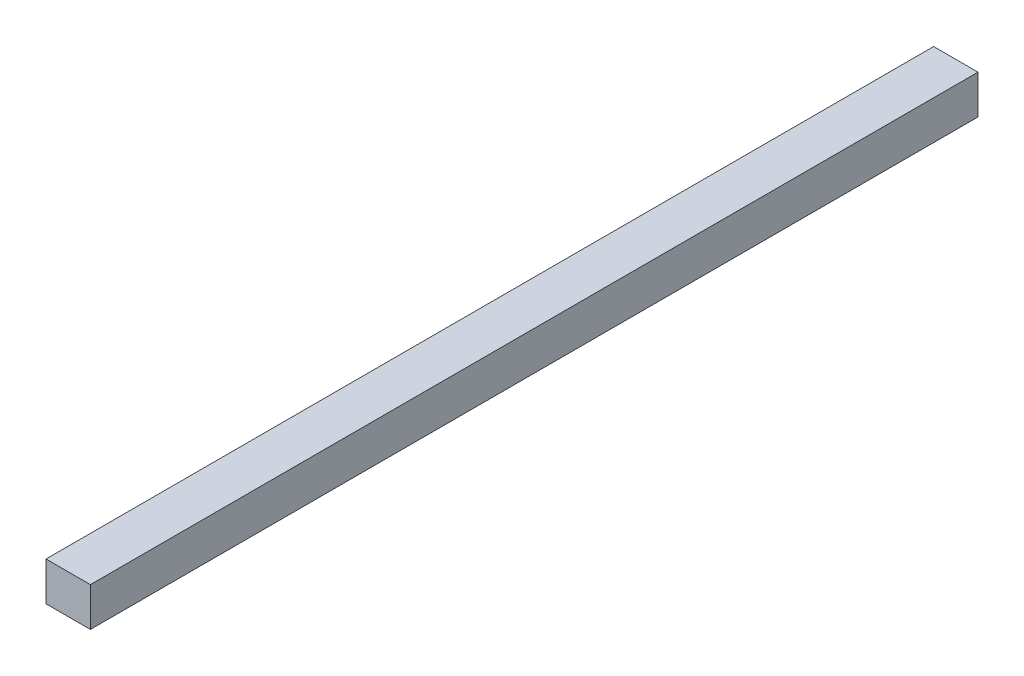
ISO-10303-21;
HEADER;
FILE_DESCRIPTION(('STEP AP214'),'2;1');
FILE_NAME('part.step','',(''),(''),'','','');
FILE_SCHEMA(('AUTOMOTIVE_DESIGN { 1 0 10303 214 1 1 1 1 }'));
ENDSEC;
DATA;
#1=APPLICATION_CONTEXT('core data for automotive mechanical design processes');
#2=APPLICATION_PROTOCOL_DEFINITION('international standard','automotive_design',2000,#1);
#3=PRODUCT_CONTEXT('',#1,'mechanical');
#4=PRODUCT('Part','Part','',(#3));
#5=PRODUCT_RELATED_PRODUCT_CATEGORY('part','',(#4));
#6=PRODUCT_DEFINITION_FORMATION('','',#4);
#7=PRODUCT_DEFINITION_CONTEXT('part definition',#1,'design');
#8=PRODUCT_DEFINITION('design','',#6,#7);
#9=PRODUCT_DEFINITION_SHAPE('','',#8);
#10=(LENGTH_UNIT() NAMED_UNIT(*) SI_UNIT(.MILLI.,.METRE.));
#11=(NAMED_UNIT(*) PLANE_ANGLE_UNIT() SI_UNIT($,.RADIAN.));
#12=(NAMED_UNIT(*) SI_UNIT($,.STERADIAN.) SOLID_ANGLE_UNIT());
#13=UNCERTAINTY_MEASURE_WITH_UNIT(LENGTH_MEASURE(1.E-05),#10,'distance_accuracy_value','');
#14=(GEOMETRIC_REPRESENTATION_CONTEXT(3) GLOBAL_UNCERTAINTY_ASSIGNED_CONTEXT((#13)) GLOBAL_UNIT_ASSIGNED_CONTEXT((#10,
#11,#12)) REPRESENTATION_CONTEXT('',''));
#15=CARTESIAN_POINT('',(0.,0.,0.));
#16=DIRECTION('',(0.,0.,1.));
#17=DIRECTION('',(1.,0.,0.));
#18=AXIS2_PLACEMENT_3D('',#15,#16,#17);
#19=CARTESIAN_POINT('',(23.496472392638,9.625,-214.496472392638));
#20=DIRECTION('',(1.,0.,0.));
#21=DIRECTION('',(0.,0.,-1.));
#22=AXIS2_PLACEMENT_3D('',#19,#20,#21);
#23=PLANE('',#22);
#24=DIRECTION('',(0.,0.,1.));
#25=VECTOR('',#24,1.);
#26=CARTESIAN_POINT('',(23.496472392638,-7.875,-214.496472392638));
#27=LINE('',#26,#25);
#28=CARTESIAN_POINT('',(23.496472392638,-7.875,-214.496472392638));
#29=VERTEX_POINT('',#28);
#30=CARTESIAN_POINT('',(23.496472392638,-7.875,185.503527607362));
#31=VERTEX_POINT('',#30);
#32=EDGE_CURVE('E102',#29,#31,#27,.T.);
#33=ORIENTED_EDGE('',*,*,#32,.T.);
#34=DIRECTION('',(0.,-1.,0.));
#35=VECTOR('',#34,1.);
#36=CARTESIAN_POINT('',(23.496472392638,9.625,185.503527607362));
#37=LINE('',#36,#35);
#38=CARTESIAN_POINT('',(23.496472392638,9.625,185.503527607362));
#39=VERTEX_POINT('',#38);
#40=EDGE_CURVE('E11',#39,#31,#37,.T.);
#41=ORIENTED_EDGE('',*,*,#40,.F.);
#42=DIRECTION('',(0.,0.,1.));
#43=VECTOR('',#42,1.);
#44=CARTESIAN_POINT('',(23.496472392638,9.625,-214.496472392638));
#45=LINE('',#44,#43);
#46=CARTESIAN_POINT('',(23.496472392638,9.625,-214.496472392638));
#47=VERTEX_POINT('',#46);
#48=EDGE_CURVE('E90',#47,#39,#45,.T.);
#49=ORIENTED_EDGE('',*,*,#48,.F.);
#50=DIRECTION('',(0.,-1.,0.));
#51=VECTOR('',#50,1.);
#52=CARTESIAN_POINT('',(23.496472392638,9.625,-214.496472392638));
#53=LINE('',#52,#51);
#54=EDGE_CURVE('E98',#47,#29,#53,.T.);
#55=ORIENTED_EDGE('',*,*,#54,.T.);
#56=EDGE_LOOP('',(#33,#41,#49,#55));
#57=FACE_BOUND('',#56,.T.);
#58=ADVANCED_FACE('F39',(#57),#23,.F.);
#59=CARTESIAN_POINT('',(23.496472392638,9.625,185.503527607362));
#60=DIRECTION('',(0.,0.,-1.));
#61=DIRECTION('',(-1.,0.,0.));
#62=AXIS2_PLACEMENT_3D('',#59,#60,#61);
#63=PLANE('',#62);
#64=DIRECTION('',(1.,0.,0.));
#65=VECTOR('',#64,1.);
#66=CARTESIAN_POINT('',(23.496472392638,-7.875,185.503527607362));
#67=LINE('',#66,#65);
#68=CARTESIAN_POINT('',(43.496472392638,-7.875,185.503527607362));
#69=VERTEX_POINT('',#68);
#70=EDGE_CURVE('E94',#31,#69,#67,.T.);
#71=ORIENTED_EDGE('',*,*,#70,.T.);
#72=DIRECTION('',(0.,-1.,0.));
#73=VECTOR('',#72,1.);
#74=CARTESIAN_POINT('',(43.496472392638,9.625,185.503527607362));
#75=LINE('',#74,#73);
#76=CARTESIAN_POINT('',(43.496472392638,9.625,185.503527607362));
#77=VERTEX_POINT('',#76);
#78=EDGE_CURVE('E47',#77,#69,#75,.T.);
#79=ORIENTED_EDGE('',*,*,#78,.F.);
#80=DIRECTION('',(1.,0.,0.));
#81=VECTOR('',#80,1.);
#82=CARTESIAN_POINT('',(23.496472392638,9.625,185.503527607362));
#83=LINE('',#82,#81);
#84=EDGE_CURVE('E85',#39,#77,#83,.T.);
#85=ORIENTED_EDGE('',*,*,#84,.F.);
#86=ORIENTED_EDGE('',*,*,#40,.T.);
#87=EDGE_LOOP('',(#71,#79,#85,#86));
#88=FACE_BOUND('',#87,.T.);
#89=ADVANCED_FACE('F93',(#88),#63,.F.);
#90=CARTESIAN_POINT('',(43.496472392638,9.625,-214.496472392638));
#91=DIRECTION('',(-1.,0.,0.));
#92=DIRECTION('',(0.,0.,1.));
#93=AXIS2_PLACEMENT_3D('',#90,#91,#92);
#94=PLANE('',#93);
#95=DIRECTION('',(0.,0.,-1.));
#96=VECTOR('',#95,1.);
#97=CARTESIAN_POINT('',(43.496472392638,-7.875,-214.496472392638));
#98=LINE('',#97,#96);
#99=CARTESIAN_POINT('',(43.496472392638,-7.875,-214.496472392638));
#100=VERTEX_POINT('',#99);
#101=EDGE_CURVE('E72',#69,#100,#98,.T.);
#102=ORIENTED_EDGE('',*,*,#101,.T.);
#103=DIRECTION('',(0.,-1.,0.));
#104=VECTOR('',#103,1.);
#105=CARTESIAN_POINT('',(43.496472392638,9.625,-214.496472392638));
#106=LINE('',#105,#104);
#107=CARTESIAN_POINT('',(43.496472392638,9.625,-214.496472392638));
#108=VERTEX_POINT('',#107);
#109=EDGE_CURVE('E95',#108,#100,#106,.T.);
#110=ORIENTED_EDGE('',*,*,#109,.F.);
#111=DIRECTION('',(0.,0.,-1.));
#112=VECTOR('',#111,1.);
#113=CARTESIAN_POINT('',(43.496472392638,9.625,-214.496472392638));
#114=LINE('',#113,#112);
#115=EDGE_CURVE('E88',#77,#108,#114,.T.);
#116=ORIENTED_EDGE('',*,*,#115,.F.);
#117=ORIENTED_EDGE('',*,*,#78,.T.);
#118=EDGE_LOOP('',(#102,#110,#116,#117));
#119=FACE_BOUND('',#118,.T.);
#120=ADVANCED_FACE('F96',(#119),#94,.F.);
#121=CARTESIAN_POINT('',(23.496472392638,9.625,-214.496472392638));
#122=DIRECTION('',(0.,0.,1.));
#123=DIRECTION('',(1.,0.,0.));
#124=AXIS2_PLACEMENT_3D('',#121,#122,#123);
#125=PLANE('',#124);
#126=DIRECTION('',(-1.,0.,0.));
#127=VECTOR('',#126,1.);
#128=CARTESIAN_POINT('',(23.496472392638,-7.875,-214.496472392638));
#129=LINE('',#128,#127);
#130=EDGE_CURVE('E78',#100,#29,#129,.T.);
#131=ORIENTED_EDGE('',*,*,#130,.T.);
#132=ORIENTED_EDGE('',*,*,#54,.F.);
#133=DIRECTION('',(-1.,0.,0.));
#134=VECTOR('',#133,1.);
#135=CARTESIAN_POINT('',(23.496472392638,9.625,-214.496472392638));
#136=LINE('',#135,#134);
#137=EDGE_CURVE('E55',#108,#47,#136,.T.);
#138=ORIENTED_EDGE('',*,*,#137,.F.);
#139=ORIENTED_EDGE('',*,*,#109,.T.);
#140=EDGE_LOOP('',(#131,#132,#138,#139));
#141=FACE_BOUND('',#140,.T.);
#142=ADVANCED_FACE('F109',(#141),#125,.F.);
#143=CARTESIAN_POINT('',(-301.468251533742,9.625,130.468251533742));
#144=DIRECTION('',(0.,1.,0.));
#145=DIRECTION('',(0.,0.,1.));
#146=AXIS2_PLACEMENT_3D('',#143,#144,#145);
#147=PLANE('',#146);
#148=ORIENTED_EDGE('',*,*,#48,.T.);
#149=ORIENTED_EDGE('',*,*,#84,.T.);
#150=ORIENTED_EDGE('',*,*,#115,.T.);
#151=ORIENTED_EDGE('',*,*,#137,.T.);
#152=EDGE_LOOP('',(#148,#149,#150,#151));
#153=FACE_BOUND('',#152,.T.);
#154=ADVANCED_FACE('F86',(#153),#147,.T.);
#155=CARTESIAN_POINT('',(-301.468251533742,-7.875,130.468251533742));
#156=DIRECTION('',(0.,1.,0.));
#157=DIRECTION('',(0.,0.,1.));
#158=AXIS2_PLACEMENT_3D('',#155,#156,#157);
#159=PLANE('',#158);
#160=ORIENTED_EDGE('',*,*,#32,.F.);
#161=ORIENTED_EDGE('',*,*,#130,.F.);
#162=ORIENTED_EDGE('',*,*,#101,.F.);
#163=ORIENTED_EDGE('',*,*,#70,.F.);
#164=EDGE_LOOP('',(#160,#161,#162,#163));
#165=FACE_BOUND('',#164,.T.);
#166=ADVANCED_FACE('F112',(#165),#159,.F.);
#167=CLOSED_SHELL('',(#58,#89,#120,#142,#154,#166));
#168=MANIFOLD_SOLID_BREP('B2',#167);
#169=ADVANCED_BREP_SHAPE_REPRESENTATION('',(#18,#168),#14);
#170=SHAPE_DEFINITION_REPRESENTATION(#9,#169);
ENDSEC;
END-ISO-10303-21;
